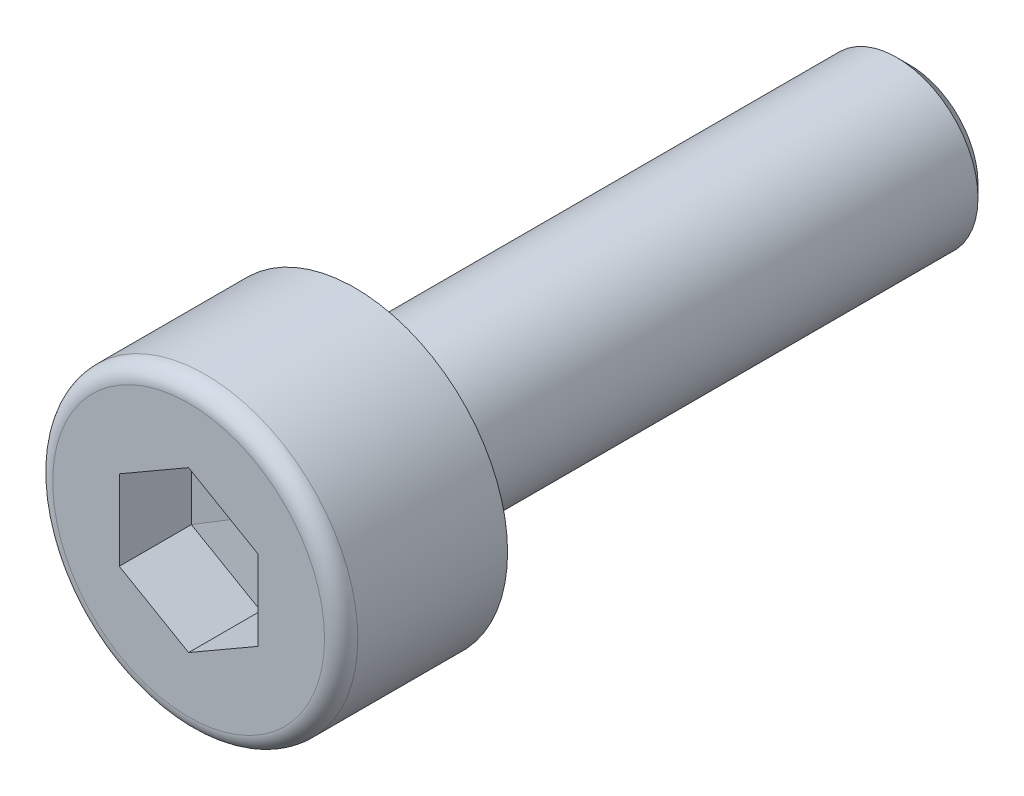
ISO-10303-21;
HEADER;
FILE_DESCRIPTION(('STEP AP214'),'2;1');
FILE_NAME('part.step','',(''),(''),'','','');
FILE_SCHEMA(('AUTOMOTIVE_DESIGN { 1 0 10303 214 1 1 1 1 }'));
ENDSEC;
DATA;
#1=APPLICATION_CONTEXT('core data for automotive mechanical design processes');
#2=APPLICATION_PROTOCOL_DEFINITION('international standard','automotive_design',2000,#1);
#3=PRODUCT_CONTEXT('',#1,'mechanical');
#4=PRODUCT('Part','Part','',(#3));
#5=PRODUCT_RELATED_PRODUCT_CATEGORY('part','',(#4));
#6=PRODUCT_DEFINITION_FORMATION('','',#4);
#7=PRODUCT_DEFINITION_CONTEXT('part definition',#1,'design');
#8=PRODUCT_DEFINITION('design','',#6,#7);
#9=PRODUCT_DEFINITION_SHAPE('','',#8);
#10=(LENGTH_UNIT() NAMED_UNIT(*) SI_UNIT(.MILLI.,.METRE.));
#11=(NAMED_UNIT(*) PLANE_ANGLE_UNIT() SI_UNIT($,.RADIAN.));
#12=(NAMED_UNIT(*) SI_UNIT($,.STERADIAN.) SOLID_ANGLE_UNIT());
#13=UNCERTAINTY_MEASURE_WITH_UNIT(LENGTH_MEASURE(1.E-05),#10,'distance_accuracy_value','');
#14=(GEOMETRIC_REPRESENTATION_CONTEXT(3) GLOBAL_UNCERTAINTY_ASSIGNED_CONTEXT((#13)) GLOBAL_UNIT_ASSIGNED_CONTEXT((#10,
#11,#12)) REPRESENTATION_CONTEXT('',''));
#15=CARTESIAN_POINT('',(0.,0.,0.));
#16=DIRECTION('',(0.,0.,1.));
#17=DIRECTION('',(1.,0.,0.));
#18=AXIS2_PLACEMENT_3D('',#15,#16,#17);
#19=CARTESIAN_POINT('',(-1.5,0.,-4.14946310413657E-13));
#20=DIRECTION('',(0.,0.,-1.));
#21=DIRECTION('',(-1.,0.,0.));
#22=AXIS2_PLACEMENT_3D('',#19,#20,#21);
#23=PLANE('',#22);
#24=CARTESIAN_POINT('',(0.,0.,-4.17443857259059E-13));
#25=DIRECTION('',(0.,0.,-1.));
#26=DIRECTION('',(-1.,0.,0.));
#27=AXIS2_PLACEMENT_3D('',#24,#25,#26);
#28=CIRCLE('',#27,1.4635);
#29=CARTESIAN_POINT('',(1.4635,0.,-4.19829860290059E-13));
#30=VERTEX_POINT('',#29);
#31=EDGE_CURVE('E11',#30,#30,#28,.T.);
#32=ORIENTED_EDGE('',*,*,#31,.F.);
#33=EDGE_LOOP('',(#32));
#34=FACE_BOUND('',#33,.T.);
#35=CARTESIAN_POINT('',(0.,0.,-7.65187364799666E-13));
#36=DIRECTION('',(0.,0.,-1.));
#37=DIRECTION('',(1.,0.,0.));
#38=AXIS2_PLACEMENT_3D('',#35,#36,#37);
#39=CIRCLE('',#38,2.75);
#40=CARTESIAN_POINT('',(2.75,0.,-7.6966211182139E-13));
#41=VERTEX_POINT('',#40);
#42=EDGE_CURVE('E134',#41,#41,#39,.T.);
#43=ORIENTED_EDGE('',*,*,#42,.T.);
#44=EDGE_LOOP('',(#43));
#45=FACE_BOUND('',#44,.T.);
#46=ADVANCED_FACE('F17',(#34,#45),#23,.T.);
#47=CARTESIAN_POINT('',(0.,0.,-10.));
#48=DIRECTION('',(0.,0.,-1.));
#49=DIRECTION('',(-1.,0.,0.));
#50=AXIS2_PLACEMENT_3D('',#47,#48,#49);
#51=PLANE('',#50);
#52=CARTESIAN_POINT('',(0.,0.,-10.));
#53=DIRECTION('',(0.,0.,-1.));
#54=DIRECTION('',(-1.,0.,0.));
#55=AXIS2_PLACEMENT_3D('',#52,#53,#54);
#56=CIRCLE('',#55,1.23000000000186);
#57=CARTESIAN_POINT('',(1.23000000000186,0.,-10.));
#58=VERTEX_POINT('',#57);
#59=EDGE_CURVE('E229',#58,#58,#56,.T.);
#60=ORIENTED_EDGE('',*,*,#59,.T.);
#61=EDGE_LOOP('',(#60));
#62=FACE_BOUND('',#61,.T.);
#63=ADVANCED_FACE('F299',(#62),#51,.T.);
#64=CARTESIAN_POINT('',(0.,0.,-5.00000000000021));
#65=DIRECTION('',(0.,0.,-1.));
#66=DIRECTION('',(-1.,0.,0.));
#67=AXIS2_PLACEMENT_3D('',#64,#65,#66);
#68=CYLINDRICAL_SURFACE('',#67,1.4635);
#69=CARTESIAN_POINT('',(0.,0.,-9.7665000000021));
#70=DIRECTION('',(0.,0.,1.));
#71=DIRECTION('',(-1.,0.,0.));
#72=AXIS2_PLACEMENT_3D('',#69,#70,#71);
#73=CIRCLE('',#72,1.4635);
#74=CARTESIAN_POINT('',(1.46349999999998,0.,-9.7665000000021));
#75=VERTEX_POINT('',#74);
#76=EDGE_CURVE('E222',#75,#75,#73,.T.);
#77=ORIENTED_EDGE('',*,*,#76,.T.);
#78=DIRECTION('',(0.,0.,1.));
#79=VECTOR('',#78,1.);
#80=CARTESIAN_POINT('',(1.4635,0.,-5.00000000000021));
#81=LINE('',#80,#79);
#82=EDGE_CURVE('E25',#75,#30,#81,.T.);
#83=ORIENTED_EDGE('',*,*,#82,.T.);
#84=ORIENTED_EDGE('',*,*,#31,.T.);
#85=ORIENTED_EDGE('',*,*,#82,.F.);
#86=EDGE_LOOP('',(#77,#83,#84,#85));
#87=FACE_BOUND('',#86,.T.);
#88=ADVANCED_FACE('F220',(#87),#68,.T.);
#89=CARTESIAN_POINT('',(-1.25,-0.721687836487032,3.));
#90=DIRECTION('',(-1.,0.,0.));
#91=DIRECTION('',(0.,0.,1.));
#92=AXIS2_PLACEMENT_3D('',#89,#90,#91);
#93=PLANE('',#92);
#94=DIRECTION('',(0.,1.,0.));
#95=VECTOR('',#94,1.);
#96=CARTESIAN_POINT('',(-1.25,-0.360843918243516,2.99999999999968));
#97=LINE('',#96,#95);
#98=CARTESIAN_POINT('',(-1.25,-0.721687836487032,3.));
#99=VERTEX_POINT('',#98);
#100=CARTESIAN_POINT('',(-1.25,0.721687836487032,3.));
#101=VERTEX_POINT('',#100);
#102=EDGE_CURVE('E116',#99,#101,#97,.T.);
#103=ORIENTED_EDGE('',*,*,#102,.F.);
#104=DIRECTION('',(0.,0.,-1.));
#105=VECTOR('',#104,1.);
#106=CARTESIAN_POINT('',(-1.25,-0.721687836487032,3.));
#107=LINE('',#106,#105);
#108=CARTESIAN_POINT('',(-1.25,-0.721687836487032,1.7));
#109=VERTEX_POINT('',#108);
#110=EDGE_CURVE('E214',#99,#109,#107,.T.);
#111=ORIENTED_EDGE('',*,*,#110,.T.);
#112=DIRECTION('',(0.,1.,0.));
#113=VECTOR('',#112,1.);
#114=CARTESIAN_POINT('',(-1.25,-0.721687836487032,1.7));
#115=LINE('',#114,#113);
#116=CARTESIAN_POINT('',(-1.25,0.721687836487032,1.7));
#117=VERTEX_POINT('',#116);
#118=EDGE_CURVE('E119',#109,#117,#115,.T.);
#119=ORIENTED_EDGE('',*,*,#118,.T.);
#120=DIRECTION('',(0.,0.,-1.));
#121=VECTOR('',#120,1.);
#122=CARTESIAN_POINT('',(-1.25,0.721687836487032,3.));
#123=LINE('',#122,#121);
#124=EDGE_CURVE('E44',#101,#117,#123,.T.);
#125=ORIENTED_EDGE('',*,*,#124,.F.);
#126=EDGE_LOOP('',(#103,#111,#119,#125));
#127=FACE_BOUND('',#126,.T.);
#128=ADVANCED_FACE('F115',(#127),#93,.F.);
#129=CARTESIAN_POINT('',(0.,-1.44337567297406,3.));
#130=DIRECTION('',(-0.5,-0.866025403784439,0.));
#131=DIRECTION('',(-0.866025403784439,0.5,0.));
#132=AXIS2_PLACEMENT_3D('',#129,#130,#131);
#133=PLANE('',#132);
#134=DIRECTION('',(-0.866025403784439,0.5,0.));
#135=VECTOR('',#134,1.);
#136=CARTESIAN_POINT('',(-1.34375,-0.667561248750503,2.99999999999968));
#137=LINE('',#136,#135);
#138=CARTESIAN_POINT('',(0.,-1.44337567297406,3.));
#139=VERTEX_POINT('',#138);
#140=EDGE_CURVE('E132',#139,#99,#137,.T.);
#141=ORIENTED_EDGE('',*,*,#140,.F.);
#142=DIRECTION('',(0.,0.,-1.));
#143=VECTOR('',#142,1.);
#144=CARTESIAN_POINT('',(0.,-1.44337567297406,3.));
#145=LINE('',#144,#143);
#146=CARTESIAN_POINT('',(0.,-1.44337567297406,1.7));
#147=VERTEX_POINT('',#146);
#148=EDGE_CURVE('E211',#139,#147,#145,.T.);
#149=ORIENTED_EDGE('',*,*,#148,.T.);
#150=DIRECTION('',(-0.866025403784439,0.5,0.));
#151=VECTOR('',#150,1.);
#152=CARTESIAN_POINT('',(0.,-1.44337567297406,1.7));
#153=LINE('',#152,#151);
#154=EDGE_CURVE('E181',#147,#109,#153,.T.);
#155=ORIENTED_EDGE('',*,*,#154,.T.);
#156=ORIENTED_EDGE('',*,*,#110,.F.);
#157=EDGE_LOOP('',(#141,#149,#155,#156));
#158=FACE_BOUND('',#157,.T.);
#159=ADVANCED_FACE('F259',(#158),#133,.F.);
#160=CARTESIAN_POINT('',(1.25,-0.721687836487033,3.));
#161=DIRECTION('',(0.5,-0.866025403784439,0.));
#162=DIRECTION('',(0.,0.,-1.));
#163=AXIS2_PLACEMENT_3D('',#160,#161,#162);
#164=PLANE('',#163);
#165=DIRECTION('',(-0.866025403784439,-0.5,0.));
#166=VECTOR('',#165,1.);
#167=CARTESIAN_POINT('',(-0.0937500000000033,-1.49750226071059,2.99999999999967));
#168=LINE('',#167,#166);
#169=CARTESIAN_POINT('',(1.25,-0.721687836487033,3.));
#170=VERTEX_POINT('',#169);
#171=EDGE_CURVE('E168',#170,#139,#168,.T.);
#172=ORIENTED_EDGE('',*,*,#171,.F.);
#173=DIRECTION('',(0.,0.,-1.));
#174=VECTOR('',#173,1.);
#175=CARTESIAN_POINT('',(1.25,-0.721687836487033,3.));
#176=LINE('',#175,#174);
#177=CARTESIAN_POINT('',(1.25,-0.721687836487033,1.7));
#178=VERTEX_POINT('',#177);
#179=EDGE_CURVE('E208',#170,#178,#176,.T.);
#180=ORIENTED_EDGE('',*,*,#179,.T.);
#181=DIRECTION('',(-0.866025403784439,-0.5,0.));
#182=VECTOR('',#181,1.);
#183=CARTESIAN_POINT('',(1.25,-0.721687836487033,1.7));
#184=LINE('',#183,#182);
#185=EDGE_CURVE('E159',#178,#147,#184,.T.);
#186=ORIENTED_EDGE('',*,*,#185,.T.);
#187=ORIENTED_EDGE('',*,*,#148,.F.);
#188=EDGE_LOOP('',(#172,#180,#186,#187));
#189=FACE_BOUND('',#188,.T.);
#190=ADVANCED_FACE('F255',(#189),#164,.F.);
#191=CARTESIAN_POINT('',(1.25,0.721687836487032,3.));
#192=DIRECTION('',(1.,0.,0.));
#193=DIRECTION('',(0.,-1.,0.));
#194=AXIS2_PLACEMENT_3D('',#191,#192,#193);
#195=PLANE('',#194);
#196=DIRECTION('',(0.,-1.,0.));
#197=VECTOR('',#196,1.);
#198=CARTESIAN_POINT('',(1.25,0.360843918243516,2.99999999999967));
#199=LINE('',#198,#197);
#200=CARTESIAN_POINT('',(1.25,0.721687836487032,3.));
#201=VERTEX_POINT('',#200);
#202=EDGE_CURVE('E147',#201,#170,#199,.T.);
#203=ORIENTED_EDGE('',*,*,#202,.F.);
#204=DIRECTION('',(0.,0.,-1.));
#205=VECTOR('',#204,1.);
#206=CARTESIAN_POINT('',(1.25,0.721687836487032,3.));
#207=LINE('',#206,#205);
#208=CARTESIAN_POINT('',(1.25,0.721687836487032,1.7));
#209=VERTEX_POINT('',#208);
#210=EDGE_CURVE('E205',#201,#209,#207,.T.);
#211=ORIENTED_EDGE('',*,*,#210,.T.);
#212=DIRECTION('',(0.,-1.,0.));
#213=VECTOR('',#212,1.);
#214=CARTESIAN_POINT('',(1.25,0.721687836487032,1.7));
#215=LINE('',#214,#213);
#216=EDGE_CURVE('E185',#209,#178,#215,.T.);
#217=ORIENTED_EDGE('',*,*,#216,.T.);
#218=ORIENTED_EDGE('',*,*,#179,.F.);
#219=EDGE_LOOP('',(#203,#211,#217,#218));
#220=FACE_BOUND('',#219,.T.);
#221=ADVANCED_FACE('F276',(#220),#195,.F.);
#222=CARTESIAN_POINT('',(0.,1.44337567297406,3.));
#223=DIRECTION('',(0.5,0.866025403784439,0.));
#224=DIRECTION('',(0.,0.,-1.));
#225=AXIS2_PLACEMENT_3D('',#222,#223,#224);
#226=PLANE('',#225);
#227=DIRECTION('',(0.866025403784439,-0.5,0.));
#228=VECTOR('',#227,1.);
#229=CARTESIAN_POINT('',(-0.71875,1.85834617895411,2.99999999999967));
#230=LINE('',#229,#228);
#231=CARTESIAN_POINT('',(0.,1.44337567297406,3.));
#232=VERTEX_POINT('',#231);
#233=EDGE_CURVE('E139',#232,#201,#230,.T.);
#234=ORIENTED_EDGE('',*,*,#233,.F.);
#235=DIRECTION('',(0.,0.,-1.));
#236=VECTOR('',#235,1.);
#237=CARTESIAN_POINT('',(0.,1.44337567297406,3.));
#238=LINE('',#237,#236);
#239=CARTESIAN_POINT('',(0.,1.44337567297406,1.7));
#240=VERTEX_POINT('',#239);
#241=EDGE_CURVE('E122',#232,#240,#238,.T.);
#242=ORIENTED_EDGE('',*,*,#241,.T.);
#243=DIRECTION('',(0.866025403784439,-0.5,0.));
#244=VECTOR('',#243,1.);
#245=CARTESIAN_POINT('',(0.,1.44337567297406,1.7));
#246=LINE('',#245,#244);
#247=EDGE_CURVE('E158',#240,#209,#246,.T.);
#248=ORIENTED_EDGE('',*,*,#247,.T.);
#249=ORIENTED_EDGE('',*,*,#210,.F.);
#250=EDGE_LOOP('',(#234,#242,#248,#249));
#251=FACE_BOUND('',#250,.T.);
#252=ADVANCED_FACE('F274',(#251),#226,.F.);
#253=CARTESIAN_POINT('',(-1.25,0.721687836487033,3.));
#254=DIRECTION('',(-0.5,0.866025403784439,0.));
#255=DIRECTION('',(0.,0.,1.));
#256=AXIS2_PLACEMENT_3D('',#253,#254,#255);
#257=PLANE('',#256);
#258=DIRECTION('',(0.866025403784439,0.5,0.));
#259=VECTOR('',#258,1.);
#260=CARTESIAN_POINT('',(-1.96875,0.306717330506988,2.99999999999968));
#261=LINE('',#260,#259);
#262=EDGE_CURVE('E129',#101,#232,#261,.T.);
#263=ORIENTED_EDGE('',*,*,#262,.F.);
#264=ORIENTED_EDGE('',*,*,#124,.T.);
#265=DIRECTION('',(0.866025403784439,0.5,0.));
#266=VECTOR('',#265,1.);
#267=CARTESIAN_POINT('',(-1.25,0.721687836487033,1.7));
#268=LINE('',#267,#266);
#269=EDGE_CURVE('E157',#117,#240,#268,.T.);
#270=ORIENTED_EDGE('',*,*,#269,.T.);
#271=ORIENTED_EDGE('',*,*,#241,.F.);
#272=EDGE_LOOP('',(#263,#264,#270,#271));
#273=FACE_BOUND('',#272,.T.);
#274=ADVANCED_FACE('F136',(#273),#257,.F.);
#275=CARTESIAN_POINT('',(-1.25,0.721687836487032,1.7));
#276=DIRECTION('',(-0.0871557427476582,0.,-0.996194698091746));
#277=DIRECTION('',(-0.996194698091746,0.,0.0871557427476582));
#278=AXIS2_PLACEMENT_3D('',#275,#276,#277);
#279=PLANE('',#278);
#280=DIRECTION('',(0.863550259614423,-0.498570974847159,-0.0755508581011305));
#281=VECTOR('',#280,1.);
#282=CARTESIAN_POINT('',(-0.939283728799942,0.542295713668084,1.67281584869695));
#283=LINE('',#282,#281);
#284=CARTESIAN_POINT('',(0.,0.,1.5906391705926));
#285=VERTEX_POINT('',#284);
#286=EDGE_CURVE('E198',#117,#285,#283,.T.);
#287=ORIENTED_EDGE('',*,*,#286,.F.);
#288=ORIENTED_EDGE('',*,*,#118,.F.);
#289=DIRECTION('',(0.863550259614423,0.498570974847158,-0.0755508581011305));
#290=VECTOR('',#289,1.);
#291=CARTESIAN_POINT('',(-0.939283728799943,-0.542295713668082,1.67281584869695));
#292=LINE('',#291,#290);
#293=EDGE_CURVE('E177',#109,#285,#292,.T.);
#294=ORIENTED_EDGE('',*,*,#293,.T.);
#295=EDGE_LOOP('',(#287,#288,#294));
#296=FACE_BOUND('',#295,.T.);
#297=ADVANCED_FACE('F263',(#296),#279,.F.);
#298=CARTESIAN_POINT('',(0.,1.44337567297406,1.7));
#299=DIRECTION('',(-0.043577871373829,0.0754790873051733,-0.996194698091746));
#300=DIRECTION('',(-0.999044587684655,0.,0.043702537889669));
#301=AXIS2_PLACEMENT_3D('',#298,#299,#300);
#302=PLANE('',#301);
#303=DIRECTION('',(0.,-0.997141949694317,-0.0755508581011306));
#304=VECTOR('',#303,1.);
#305=CARTESIAN_POINT('',(0.,1.08459142733617,1.67281584869695));
#306=LINE('',#305,#304);
#307=EDGE_CURVE('E153',#240,#285,#306,.T.);
#308=ORIENTED_EDGE('',*,*,#307,.F.);
#309=ORIENTED_EDGE('',*,*,#269,.F.);
#310=ORIENTED_EDGE('',*,*,#286,.T.);
#311=EDGE_LOOP('',(#308,#309,#310));
#312=FACE_BOUND('',#311,.T.);
#313=ADVANCED_FACE('F267',(#312),#302,.F.);
#314=CARTESIAN_POINT('',(1.25,0.721687836487032,1.7));
#315=DIRECTION('',(0.0435778713738291,0.0754790873051733,-0.996194698091746));
#316=DIRECTION('',(-0.999044587684655,0.,-0.0437025378896691));
#317=AXIS2_PLACEMENT_3D('',#314,#315,#316);
#318=PLANE('',#317);
#319=DIRECTION('',(-0.863550259614423,-0.498570974847158,-0.0755508581011305));
#320=VECTOR('',#319,1.);
#321=CARTESIAN_POINT('',(0.93928372879994,0.542295713668087,1.67281584869695));
#322=LINE('',#321,#320);
#323=EDGE_CURVE('E189',#209,#285,#322,.T.);
#324=ORIENTED_EDGE('',*,*,#323,.F.);
#325=ORIENTED_EDGE('',*,*,#247,.F.);
#326=ORIENTED_EDGE('',*,*,#307,.T.);
#327=EDGE_LOOP('',(#324,#325,#326));
#328=FACE_BOUND('',#327,.T.);
#329=ADVANCED_FACE('F271',(#328),#318,.F.);
#330=CARTESIAN_POINT('',(1.25,-0.721687836487033,1.7));
#331=DIRECTION('',(0.0871557427476581,0.,-0.996194698091746));
#332=DIRECTION('',(0.,-1.,0.));
#333=AXIS2_PLACEMENT_3D('',#330,#331,#332);
#334=PLANE('',#333);
#335=DIRECTION('',(-0.863550259614423,0.498570974847158,-0.0755508581011305));
#336=VECTOR('',#335,1.);
#337=CARTESIAN_POINT('',(0.939283728799943,-0.542295713668083,1.67281584869695));
#338=LINE('',#337,#336);
#339=EDGE_CURVE('E163',#178,#285,#338,.T.);
#340=ORIENTED_EDGE('',*,*,#339,.F.);
#341=ORIENTED_EDGE('',*,*,#216,.F.);
#342=ORIENTED_EDGE('',*,*,#323,.T.);
#343=EDGE_LOOP('',(#340,#341,#342));
#344=FACE_BOUND('',#343,.T.);
#345=ADVANCED_FACE('F279',(#344),#334,.F.);
#346=CARTESIAN_POINT('',(0.,-1.44337567297406,1.7));
#347=DIRECTION('',(0.043577871373829,-0.0754790873051733,-0.996194698091746));
#348=DIRECTION('',(0.,-0.997141949694317,0.0755508581011305));
#349=AXIS2_PLACEMENT_3D('',#346,#347,#348);
#350=PLANE('',#349);
#351=DIRECTION('',(0.,0.997141949694317,-0.0755508581011306));
#352=VECTOR('',#351,1.);
#353=CARTESIAN_POINT('',(0.,-1.08459142733616,1.67281584869695));
#354=LINE('',#353,#352);
#355=EDGE_CURVE('E164',#147,#285,#354,.T.);
#356=ORIENTED_EDGE('',*,*,#355,.F.);
#357=ORIENTED_EDGE('',*,*,#185,.F.);
#358=ORIENTED_EDGE('',*,*,#339,.T.);
#359=EDGE_LOOP('',(#356,#357,#358));
#360=FACE_BOUND('',#359,.T.);
#361=ADVANCED_FACE('F281',(#360),#350,.F.);
#362=CARTESIAN_POINT('',(-1.25,-0.721687836487032,1.7));
#363=DIRECTION('',(-0.0435778713738291,-0.0754790873051733,-0.996194698091746));
#364=DIRECTION('',(0.,-0.997141949694317,0.0755508581011305));
#365=AXIS2_PLACEMENT_3D('',#362,#363,#364);
#366=PLANE('',#365);
#367=ORIENTED_EDGE('',*,*,#293,.F.);
#368=ORIENTED_EDGE('',*,*,#154,.F.);
#369=ORIENTED_EDGE('',*,*,#355,.T.);
#370=EDGE_LOOP('',(#367,#368,#369));
#371=FACE_BOUND('',#370,.T.);
#372=ADVANCED_FACE('F283',(#371),#366,.F.);
#373=CARTESIAN_POINT('',(0.,0.,1.49999999999945));
#374=DIRECTION('',(0.,0.,-1.));
#375=DIRECTION('',(-1.,0.,0.));
#376=AXIS2_PLACEMENT_3D('',#373,#374,#375);
#377=CYLINDRICAL_SURFACE('',#376,2.75);
#378=ORIENTED_EDGE('',*,*,#42,.F.);
#379=DIRECTION('',(0.,0.,1.));
#380=VECTOR('',#379,1.);
#381=CARTESIAN_POINT('',(2.75,0.,1.49999999999945));
#382=LINE('',#381,#380);
#383=CARTESIAN_POINT('',(2.75,0.,2.69999999999967));
#384=VERTEX_POINT('',#383);
#385=EDGE_CURVE('E173',#41,#384,#382,.T.);
#386=ORIENTED_EDGE('',*,*,#385,.T.);
#387=CARTESIAN_POINT('',(0.,0.,2.69999999999967));
#388=DIRECTION('',(0.,0.,1.));
#389=DIRECTION('',(1.,0.,0.));
#390=AXIS2_PLACEMENT_3D('',#387,#388,#389);
#391=CIRCLE('',#390,2.75);
#392=EDGE_CURVE('E236',#384,#384,#391,.T.);
#393=ORIENTED_EDGE('',*,*,#392,.F.);
#394=ORIENTED_EDGE('',*,*,#385,.F.);
#395=EDGE_LOOP('',(#378,#386,#393,#394));
#396=FACE_BOUND('',#395,.T.);
#397=ADVANCED_FACE('F285',(#396),#377,.T.);
#398=CARTESIAN_POINT('',(-2.75,0.,2.99999999999968));
#399=DIRECTION('',(0.,0.,1.));
#400=DIRECTION('',(1.,0.,0.));
#401=AXIS2_PLACEMENT_3D('',#398,#399,#400);
#402=PLANE('',#401);
#403=ORIENTED_EDGE('',*,*,#262,.T.);
#404=ORIENTED_EDGE('',*,*,#233,.T.);
#405=ORIENTED_EDGE('',*,*,#202,.T.);
#406=ORIENTED_EDGE('',*,*,#171,.T.);
#407=ORIENTED_EDGE('',*,*,#140,.T.);
#408=ORIENTED_EDGE('',*,*,#102,.T.);
#409=EDGE_LOOP('',(#403,#404,#405,#406,#407,#408));
#410=FACE_BOUND('',#409,.T.);
#411=CARTESIAN_POINT('',(0.,0.,2.99999999999967));
#412=DIRECTION('',(0.,0.,-1.));
#413=DIRECTION('',(1.,0.,0.));
#414=AXIS2_PLACEMENT_3D('',#411,#412,#413);
#415=CIRCLE('',#414,2.45);
#416=CARTESIAN_POINT('',(2.45,0.,2.99999999999967));
#417=VERTEX_POINT('',#416);
#418=EDGE_CURVE('E140',#417,#417,#415,.T.);
#419=ORIENTED_EDGE('',*,*,#418,.F.);
#420=EDGE_LOOP('',(#419));
#421=FACE_BOUND('',#420,.T.);
#422=ADVANCED_FACE('F126',(#410,#421),#402,.T.);
#423=CARTESIAN_POINT('',(0.,0.,2.69999999999967));
#424=DIRECTION('',(0.,0.,-1.));
#425=DIRECTION('',(-1.,0.,0.));
#426=AXIS2_PLACEMENT_3D('',#423,#424,#425);
#427=TOROIDAL_SURFACE('',#426,2.45,0.3);
#428=ORIENTED_EDGE('',*,*,#392,.T.);
#429=CARTESIAN_POINT('',(2.45,0.,2.69999999999967));
#430=DIRECTION('',(0.,-1.,0.));
#431=DIRECTION('',(1.,0.,0.));
#432=AXIS2_PLACEMENT_3D('',#429,#430,#431);
#433=CIRCLE('',#432,0.3);
#434=EDGE_CURVE('E149',#384,#417,#433,.T.);
#435=ORIENTED_EDGE('',*,*,#434,.T.);
#436=ORIENTED_EDGE('',*,*,#418,.T.);
#437=ORIENTED_EDGE('',*,*,#434,.F.);
#438=EDGE_LOOP('',(#428,#435,#436,#437));
#439=FACE_BOUND('',#438,.T.);
#440=ADVANCED_FACE('F411',(#439),#427,.T.);
#441=CARTESIAN_POINT('',(0.,0.,-9.85));
#442=DIRECTION('',(0.,0.,1.));
#443=DIRECTION('',(-1.,0.,0.));
#444=AXIS2_PLACEMENT_3D('',#441,#442,#443);
#445=CONICAL_SURFACE('',#444,1.38000000000201,0.785398163397962);
#446=ORIENTED_EDGE('',*,*,#76,.F.);
#447=DIRECTION('',(-0.707106781186911,0.,-0.707106781186184));
#448=VECTOR('',#447,1.);
#449=CARTESIAN_POINT('',(1.38000000000201,0.,-9.85));
#450=LINE('',#449,#448);
#451=EDGE_CURVE('E227',#75,#58,#450,.T.);
#452=ORIENTED_EDGE('',*,*,#451,.T.);
#453=ORIENTED_EDGE('',*,*,#59,.F.);
#454=ORIENTED_EDGE('',*,*,#451,.F.);
#455=EDGE_LOOP('',(#446,#452,#453,#454));
#456=FACE_BOUND('',#455,.T.);
#457=ADVANCED_FACE('F228',(#456),#445,.T.);
#458=CLOSED_SHELL('',(#46,#63,#88,#128,#159,#190,#221,#252,#274,#297,#313,#329,#345,#361,#372,
#397,#422,#440,#457));
#459=MANIFOLD_SOLID_BREP('B1',#458);
#460=ADVANCED_BREP_SHAPE_REPRESENTATION('',(#18,#459),#14);
#461=SHAPE_DEFINITION_REPRESENTATION(#9,#460);
ENDSEC;
END-ISO-10303-21;
